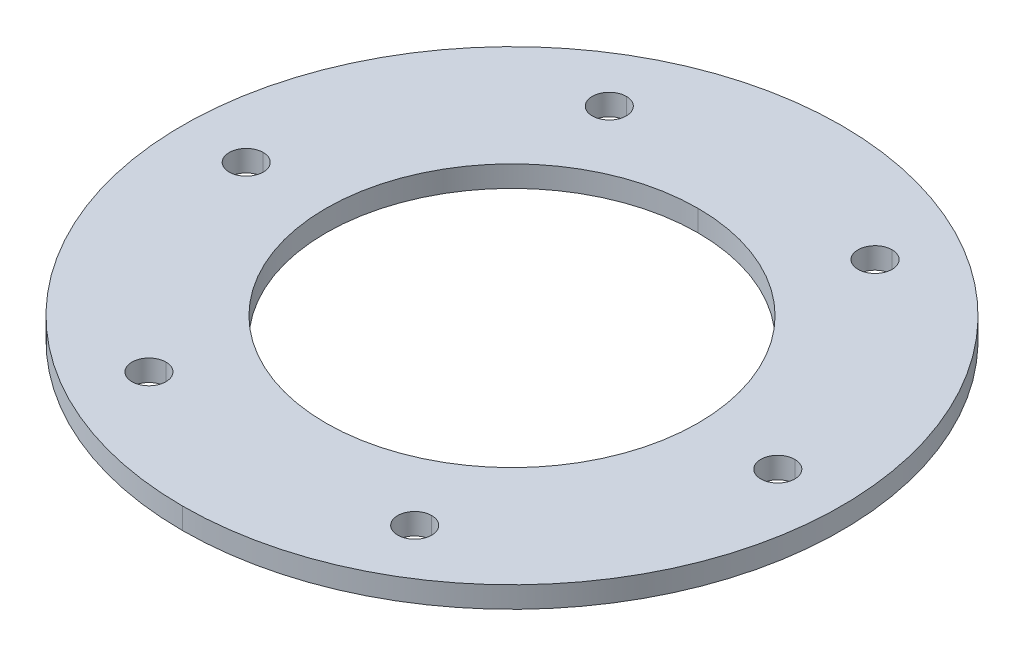
ISO-10303-21;
HEADER;
FILE_DESCRIPTION(('STEP AP214'),'2;1');
FILE_NAME('part.step','',(''),(''),'','','');
FILE_SCHEMA(('AUTOMOTIVE_DESIGN { 1 0 10303 214 1 1 1 1 }'));
ENDSEC;
DATA;
#1=APPLICATION_CONTEXT('core data for automotive mechanical design processes');
#2=APPLICATION_PROTOCOL_DEFINITION('international standard','automotive_design',2000,#1);
#3=PRODUCT_CONTEXT('',#1,'mechanical');
#4=PRODUCT('Part','Part','',(#3));
#5=PRODUCT_RELATED_PRODUCT_CATEGORY('part','',(#4));
#6=PRODUCT_DEFINITION_FORMATION('','',#4);
#7=PRODUCT_DEFINITION_CONTEXT('part definition',#1,'design');
#8=PRODUCT_DEFINITION('design','',#6,#7);
#9=PRODUCT_DEFINITION_SHAPE('','',#8);
#10=(LENGTH_UNIT() NAMED_UNIT(*) SI_UNIT(.MILLI.,.METRE.));
#11=(NAMED_UNIT(*) PLANE_ANGLE_UNIT() SI_UNIT($,.RADIAN.));
#12=(NAMED_UNIT(*) SI_UNIT($,.STERADIAN.) SOLID_ANGLE_UNIT());
#13=UNCERTAINTY_MEASURE_WITH_UNIT(LENGTH_MEASURE(1.E-05),#10,'distance_accuracy_value','');
#14=(GEOMETRIC_REPRESENTATION_CONTEXT(3) GLOBAL_UNCERTAINTY_ASSIGNED_CONTEXT((#13)) GLOBAL_UNIT_ASSIGNED_CONTEXT((#10,
#11,#12)) REPRESENTATION_CONTEXT('',''));
#15=CARTESIAN_POINT('',(0.,0.,0.));
#16=DIRECTION('',(0.,0.,1.));
#17=DIRECTION('',(1.,0.,0.));
#18=AXIS2_PLACEMENT_3D('',#15,#16,#17);
#19=CARTESIAN_POINT('',(-25.,-14.,0.));
#20=DIRECTION('',(0.,1.,0.));
#21=DIRECTION('',(0.,0.,1.));
#22=AXIS2_PLACEMENT_3D('',#19,#20,#21);
#23=CYLINDRICAL_SURFACE('',#22,1.6);
#24=DIRECTION('',(0.,1.,0.));
#25=VECTOR('',#24,1.);
#26=CARTESIAN_POINT('',(-25.,-14.,-1.6));
#27=LINE('',#26,#25);
#28=CARTESIAN_POINT('',(-25.,0.,-1.6));
#29=VERTEX_POINT('',#28);
#30=CARTESIAN_POINT('',(-25.,2.,-1.6));
#31=VERTEX_POINT('',#30);
#32=EDGE_CURVE('E253',#29,#31,#27,.T.);
#33=ORIENTED_EDGE('',*,*,#32,.F.);
#34=CARTESIAN_POINT('',(-25.,0.,0.));
#35=DIRECTION('',(0.,1.,0.));
#36=DIRECTION('',(0.,0.,1.));
#37=AXIS2_PLACEMENT_3D('',#34,#35,#36);
#38=CIRCLE('',#37,1.6);
#39=CARTESIAN_POINT('',(-25.,0.,1.6));
#40=VERTEX_POINT('',#39);
#41=EDGE_CURVE('E247',#40,#29,#38,.T.);
#42=ORIENTED_EDGE('',*,*,#41,.F.);
#43=DIRECTION('',(0.,1.,0.));
#44=VECTOR('',#43,1.);
#45=CARTESIAN_POINT('',(-25.,-14.,1.6));
#46=LINE('',#45,#44);
#47=CARTESIAN_POINT('',(-25.,2.,1.6));
#48=VERTEX_POINT('',#47);
#49=EDGE_CURVE('E20',#40,#48,#46,.T.);
#50=ORIENTED_EDGE('',*,*,#49,.T.);
#51=CARTESIAN_POINT('',(-25.,2.,0.));
#52=DIRECTION('',(0.,1.,0.));
#53=DIRECTION('',(0.,0.,1.));
#54=AXIS2_PLACEMENT_3D('',#51,#52,#53);
#55=CIRCLE('',#54,1.6);
#56=EDGE_CURVE('E259',#48,#31,#55,.T.);
#57=ORIENTED_EDGE('',*,*,#56,.T.);
#58=EDGE_LOOP('',(#33,#42,#50,#57));
#59=FACE_BOUND('',#58,.T.);
#60=ADVANCED_FACE('F16',(#59),#23,.F.);
#61=CARTESIAN_POINT('',(-12.5,-14.,-21.650635094611));
#62=DIRECTION('',(0.,1.,0.));
#63=DIRECTION('',(0.,0.,1.));
#64=AXIS2_PLACEMENT_3D('',#61,#62,#63);
#65=CYLINDRICAL_SURFACE('',#64,1.6);
#66=DIRECTION('',(0.,1.,0.));
#67=VECTOR('',#66,1.);
#68=CARTESIAN_POINT('',(-12.5,-14.,-23.2506350946109));
#69=LINE('',#68,#67);
#70=CARTESIAN_POINT('',(-12.5,0.,-23.2506350946109));
#71=VERTEX_POINT('',#70);
#72=CARTESIAN_POINT('',(-12.5,2.,-23.2506350946109));
#73=VERTEX_POINT('',#72);
#74=EDGE_CURVE('E205',#71,#73,#69,.T.);
#75=ORIENTED_EDGE('',*,*,#74,.F.);
#76=CARTESIAN_POINT('',(-12.5,0.,-21.650635094611));
#77=DIRECTION('',(0.,1.,0.));
#78=DIRECTION('',(0.,0.,1.));
#79=AXIS2_PLACEMENT_3D('',#76,#77,#78);
#80=CIRCLE('',#79,1.6);
#81=CARTESIAN_POINT('',(-12.5,0.,-20.0506350946109));
#82=VERTEX_POINT('',#81);
#83=EDGE_CURVE('E176',#82,#71,#80,.T.);
#84=ORIENTED_EDGE('',*,*,#83,.F.);
#85=DIRECTION('',(0.,1.,0.));
#86=VECTOR('',#85,1.);
#87=CARTESIAN_POINT('',(-12.5,-14.,-20.0506350946109));
#88=LINE('',#87,#86);
#89=CARTESIAN_POINT('',(-12.5,2.,-20.0506350946109));
#90=VERTEX_POINT('',#89);
#91=EDGE_CURVE('E189',#82,#90,#88,.T.);
#92=ORIENTED_EDGE('',*,*,#91,.T.);
#93=CARTESIAN_POINT('',(-12.5,2.,-21.650635094611));
#94=DIRECTION('',(0.,1.,0.));
#95=DIRECTION('',(0.,0.,1.));
#96=AXIS2_PLACEMENT_3D('',#93,#94,#95);
#97=CIRCLE('',#96,1.6);
#98=EDGE_CURVE('E262',#90,#73,#97,.T.);
#99=ORIENTED_EDGE('',*,*,#98,.T.);
#100=EDGE_LOOP('',(#75,#84,#92,#99));
#101=FACE_BOUND('',#100,.T.);
#102=ADVANCED_FACE('F384',(#101),#65,.F.);
#103=CARTESIAN_POINT('',(12.5,-14.,-21.650635094611));
#104=DIRECTION('',(0.,1.,0.));
#105=DIRECTION('',(0.,0.,1.));
#106=AXIS2_PLACEMENT_3D('',#103,#104,#105);
#107=CYLINDRICAL_SURFACE('',#106,1.6);
#108=DIRECTION('',(0.,1.,0.));
#109=VECTOR('',#108,1.);
#110=CARTESIAN_POINT('',(12.5,-14.,-23.2506350946109));
#111=LINE('',#110,#109);
#112=CARTESIAN_POINT('',(12.5,0.,-23.2506350946109));
#113=VERTEX_POINT('',#112);
#114=CARTESIAN_POINT('',(12.5,2.,-23.2506350946109));
#115=VERTEX_POINT('',#114);
#116=EDGE_CURVE('E170',#113,#115,#111,.T.);
#117=ORIENTED_EDGE('',*,*,#116,.F.);
#118=CARTESIAN_POINT('',(12.5,0.,-21.650635094611));
#119=DIRECTION('',(0.,1.,0.));
#120=DIRECTION('',(0.,0.,1.));
#121=AXIS2_PLACEMENT_3D('',#118,#119,#120);
#122=CIRCLE('',#121,1.6);
#123=CARTESIAN_POINT('',(12.5,0.,-20.0506350946109));
#124=VERTEX_POINT('',#123);
#125=EDGE_CURVE('E164',#124,#113,#122,.T.);
#126=ORIENTED_EDGE('',*,*,#125,.F.);
#127=DIRECTION('',(0.,1.,0.));
#128=VECTOR('',#127,1.);
#129=CARTESIAN_POINT('',(12.5,-14.,-20.0506350946109));
#130=LINE('',#129,#128);
#131=CARTESIAN_POINT('',(12.5,2.,-20.0506350946109));
#132=VERTEX_POINT('',#131);
#133=EDGE_CURVE('E167',#124,#132,#130,.T.);
#134=ORIENTED_EDGE('',*,*,#133,.T.);
#135=CARTESIAN_POINT('',(12.5,2.,-21.650635094611));
#136=DIRECTION('',(0.,1.,0.));
#137=DIRECTION('',(0.,0.,1.));
#138=AXIS2_PLACEMENT_3D('',#135,#136,#137);
#139=CIRCLE('',#138,1.6);
#140=EDGE_CURVE('E311',#132,#115,#139,.T.);
#141=ORIENTED_EDGE('',*,*,#140,.T.);
#142=EDGE_LOOP('',(#117,#126,#134,#141));
#143=FACE_BOUND('',#142,.T.);
#144=ADVANCED_FACE('F166',(#143),#107,.F.);
#145=CARTESIAN_POINT('',(-12.5,-14.,21.650635094611));
#146=DIRECTION('',(0.,1.,0.));
#147=DIRECTION('',(0.,0.,1.));
#148=AXIS2_PLACEMENT_3D('',#145,#146,#147);
#149=CYLINDRICAL_SURFACE('',#148,1.6);
#150=DIRECTION('',(0.,1.,0.));
#151=VECTOR('',#150,1.);
#152=CARTESIAN_POINT('',(-12.5,-14.,20.0506350946109));
#153=LINE('',#152,#151);
#154=CARTESIAN_POINT('',(-12.5,0.,20.0506350946109));
#155=VERTEX_POINT('',#154);
#156=CARTESIAN_POINT('',(-12.5,2.,20.0506350946109));
#157=VERTEX_POINT('',#156);
#158=EDGE_CURVE('E226',#155,#157,#153,.T.);
#159=ORIENTED_EDGE('',*,*,#158,.F.);
#160=CARTESIAN_POINT('',(-12.5,0.,21.650635094611));
#161=DIRECTION('',(0.,1.,0.));
#162=DIRECTION('',(0.,0.,1.));
#163=AXIS2_PLACEMENT_3D('',#160,#161,#162);
#164=CIRCLE('',#163,1.6);
#165=CARTESIAN_POINT('',(-12.5,0.,23.250635094611));
#166=VERTEX_POINT('',#165);
#167=EDGE_CURVE('E175',#166,#155,#164,.T.);
#168=ORIENTED_EDGE('',*,*,#167,.F.);
#169=DIRECTION('',(0.,1.,0.));
#170=VECTOR('',#169,1.);
#171=CARTESIAN_POINT('',(-12.5,-14.,23.250635094611));
#172=LINE('',#171,#170);
#173=CARTESIAN_POINT('',(-12.5,2.,23.250635094611));
#174=VERTEX_POINT('',#173);
#175=EDGE_CURVE('E295',#166,#174,#172,.T.);
#176=ORIENTED_EDGE('',*,*,#175,.T.);
#177=CARTESIAN_POINT('',(-12.5,2.,21.650635094611));
#178=DIRECTION('',(0.,1.,0.));
#179=DIRECTION('',(0.,0.,1.));
#180=AXIS2_PLACEMENT_3D('',#177,#178,#179);
#181=CIRCLE('',#180,1.6);
#182=EDGE_CURVE('E252',#174,#157,#181,.T.);
#183=ORIENTED_EDGE('',*,*,#182,.T.);
#184=EDGE_LOOP('',(#159,#168,#176,#183));
#185=FACE_BOUND('',#184,.T.);
#186=ADVANCED_FACE('F357',(#185),#149,.F.);
#187=CARTESIAN_POINT('',(12.5,-14.,21.650635094611));
#188=DIRECTION('',(0.,1.,0.));
#189=DIRECTION('',(0.,0.,1.));
#190=AXIS2_PLACEMENT_3D('',#187,#188,#189);
#191=CYLINDRICAL_SURFACE('',#190,1.6);
#192=DIRECTION('',(0.,1.,0.));
#193=VECTOR('',#192,1.);
#194=CARTESIAN_POINT('',(12.5,-14.,20.0506350946109));
#195=LINE('',#194,#193);
#196=CARTESIAN_POINT('',(12.5,0.,20.0506350946109));
#197=VERTEX_POINT('',#196);
#198=CARTESIAN_POINT('',(12.5,2.,20.0506350946109));
#199=VERTEX_POINT('',#198);
#200=EDGE_CURVE('E274',#197,#199,#195,.T.);
#201=ORIENTED_EDGE('',*,*,#200,.F.);
#202=CARTESIAN_POINT('',(12.5,0.,21.650635094611));
#203=DIRECTION('',(0.,1.,0.));
#204=DIRECTION('',(0.,0.,1.));
#205=AXIS2_PLACEMENT_3D('',#202,#203,#204);
#206=CIRCLE('',#205,1.6);
#207=CARTESIAN_POINT('',(12.5,0.,23.2506350946109));
#208=VERTEX_POINT('',#207);
#209=EDGE_CURVE('E265',#208,#197,#206,.T.);
#210=ORIENTED_EDGE('',*,*,#209,.F.);
#211=DIRECTION('',(0.,1.,0.));
#212=VECTOR('',#211,1.);
#213=CARTESIAN_POINT('',(12.5,-14.,23.2506350946109));
#214=LINE('',#213,#212);
#215=CARTESIAN_POINT('',(12.5,2.,23.2506350946109));
#216=VERTEX_POINT('',#215);
#217=EDGE_CURVE('E234',#208,#216,#214,.T.);
#218=ORIENTED_EDGE('',*,*,#217,.T.);
#219=CARTESIAN_POINT('',(12.5,2.,21.650635094611));
#220=DIRECTION('',(0.,1.,0.));
#221=DIRECTION('',(0.,0.,1.));
#222=AXIS2_PLACEMENT_3D('',#219,#220,#221);
#223=CIRCLE('',#222,1.6);
#224=EDGE_CURVE('E249',#216,#199,#223,.T.);
#225=ORIENTED_EDGE('',*,*,#224,.T.);
#226=EDGE_LOOP('',(#201,#210,#218,#225));
#227=FACE_BOUND('',#226,.T.);
#228=ADVANCED_FACE('F405',(#227),#191,.F.);
#229=CARTESIAN_POINT('',(25.,-14.,0.));
#230=DIRECTION('',(0.,1.,0.));
#231=DIRECTION('',(0.,0.,1.));
#232=AXIS2_PLACEMENT_3D('',#229,#230,#231);
#233=CYLINDRICAL_SURFACE('',#232,1.6);
#234=DIRECTION('',(0.,1.,0.));
#235=VECTOR('',#234,1.);
#236=CARTESIAN_POINT('',(25.,-14.,-1.6));
#237=LINE('',#236,#235);
#238=CARTESIAN_POINT('',(25.,0.,-1.6));
#239=VERTEX_POINT('',#238);
#240=CARTESIAN_POINT('',(25.,2.,-1.6));
#241=VERTEX_POINT('',#240);
#242=EDGE_CURVE('E213',#239,#241,#237,.T.);
#243=ORIENTED_EDGE('',*,*,#242,.F.);
#244=CARTESIAN_POINT('',(25.,0.,0.));
#245=DIRECTION('',(0.,1.,0.));
#246=DIRECTION('',(0.,0.,1.));
#247=AXIS2_PLACEMENT_3D('',#244,#245,#246);
#248=CIRCLE('',#247,1.6);
#249=CARTESIAN_POINT('',(25.,0.,1.6));
#250=VERTEX_POINT('',#249);
#251=EDGE_CURVE('E27',#250,#239,#248,.T.);
#252=ORIENTED_EDGE('',*,*,#251,.F.);
#253=DIRECTION('',(0.,1.,0.));
#254=VECTOR('',#253,1.);
#255=CARTESIAN_POINT('',(25.,-14.,1.6));
#256=LINE('',#255,#254);
#257=CARTESIAN_POINT('',(25.,2.,1.6));
#258=VERTEX_POINT('',#257);
#259=EDGE_CURVE('E302',#250,#258,#256,.T.);
#260=ORIENTED_EDGE('',*,*,#259,.T.);
#261=CARTESIAN_POINT('',(25.,2.,0.));
#262=DIRECTION('',(0.,1.,0.));
#263=DIRECTION('',(0.,0.,1.));
#264=AXIS2_PLACEMENT_3D('',#261,#262,#263);
#265=CIRCLE('',#264,1.6);
#266=EDGE_CURVE('E248',#258,#241,#265,.T.);
#267=ORIENTED_EDGE('',*,*,#266,.T.);
#268=EDGE_LOOP('',(#243,#252,#260,#267));
#269=FACE_BOUND('',#268,.T.);
#270=ADVANCED_FACE('F344',(#269),#233,.F.);
#271=CARTESIAN_POINT('',(0.,0.,0.));
#272=DIRECTION('',(0.,1.,0.));
#273=DIRECTION('',(0.,0.,1.));
#274=AXIS2_PLACEMENT_3D('',#271,#272,#273);
#275=CYLINDRICAL_SURFACE('',#274,17.5);
#276=DIRECTION('',(0.,1.,0.));
#277=VECTOR('',#276,1.);
#278=CARTESIAN_POINT('',(0.,0.,-17.5));
#279=LINE('',#278,#277);
#280=CARTESIAN_POINT('',(0.,0.,-17.5));
#281=VERTEX_POINT('',#280);
#282=CARTESIAN_POINT('',(0.,2.,-17.5));
#283=VERTEX_POINT('',#282);
#284=EDGE_CURVE('E239',#281,#283,#279,.T.);
#285=ORIENTED_EDGE('',*,*,#284,.F.);
#286=CARTESIAN_POINT('',(0.,0.,0.));
#287=DIRECTION('',(0.,1.,0.));
#288=DIRECTION('',(0.,0.,1.));
#289=AXIS2_PLACEMENT_3D('',#286,#287,#288);
#290=CIRCLE('',#289,17.5);
#291=CARTESIAN_POINT('',(0.,0.,17.5));
#292=VERTEX_POINT('',#291);
#293=EDGE_CURVE('E11',#292,#281,#290,.T.);
#294=ORIENTED_EDGE('',*,*,#293,.F.);
#295=DIRECTION('',(0.,1.,0.));
#296=VECTOR('',#295,1.);
#297=CARTESIAN_POINT('',(0.,0.,17.5));
#298=LINE('',#297,#296);
#299=CARTESIAN_POINT('',(0.,2.,17.5));
#300=VERTEX_POINT('',#299);
#301=EDGE_CURVE('E287',#292,#300,#298,.T.);
#302=ORIENTED_EDGE('',*,*,#301,.T.);
#303=CARTESIAN_POINT('',(0.,2.,0.));
#304=DIRECTION('',(0.,1.,0.));
#305=DIRECTION('',(0.,0.,1.));
#306=AXIS2_PLACEMENT_3D('',#303,#304,#305);
#307=CIRCLE('',#306,17.5);
#308=EDGE_CURVE('E244',#300,#283,#307,.T.);
#309=ORIENTED_EDGE('',*,*,#308,.T.);
#310=EDGE_LOOP('',(#285,#294,#302,#309));
#311=FACE_BOUND('',#310,.T.);
#312=ADVANCED_FACE('F348',(#311),#275,.F.);
#313=CARTESIAN_POINT('',(0.,0.,0.));
#314=DIRECTION('',(0.,1.,0.));
#315=DIRECTION('',(1.,0.,0.));
#316=AXIS2_PLACEMENT_3D('',#313,#314,#315);
#317=PLANE('',#316);
#318=ORIENTED_EDGE('',*,*,#293,.T.);
#319=CARTESIAN_POINT('',(0.,0.,0.));
#320=DIRECTION('',(0.,1.,0.));
#321=DIRECTION('',(0.,0.,1.));
#322=AXIS2_PLACEMENT_3D('',#319,#320,#321);
#323=CIRCLE('',#322,17.5);
#324=EDGE_CURVE('E243',#281,#292,#323,.T.);
#325=ORIENTED_EDGE('',*,*,#324,.T.);
#326=EDGE_LOOP('',(#318,#325));
#327=FACE_BOUND('',#326,.T.);
#328=ORIENTED_EDGE('',*,*,#251,.T.);
#329=CARTESIAN_POINT('',(25.,0.,0.));
#330=DIRECTION('',(0.,1.,0.));
#331=DIRECTION('',(0.,0.,1.));
#332=AXIS2_PLACEMENT_3D('',#329,#330,#331);
#333=CIRCLE('',#332,1.6);
#334=EDGE_CURVE('E218',#239,#250,#333,.T.);
#335=ORIENTED_EDGE('',*,*,#334,.T.);
#336=EDGE_LOOP('',(#328,#335));
#337=FACE_BOUND('',#336,.T.);
#338=ORIENTED_EDGE('',*,*,#209,.T.);
#339=CARTESIAN_POINT('',(12.5,0.,21.650635094611));
#340=DIRECTION('',(0.,1.,0.));
#341=DIRECTION('',(0.,0.,1.));
#342=AXIS2_PLACEMENT_3D('',#339,#340,#341);
#343=CIRCLE('',#342,1.6);
#344=EDGE_CURVE('E291',#197,#208,#343,.T.);
#345=ORIENTED_EDGE('',*,*,#344,.T.);
#346=EDGE_LOOP('',(#338,#345));
#347=FACE_BOUND('',#346,.T.);
#348=ORIENTED_EDGE('',*,*,#167,.T.);
#349=CARTESIAN_POINT('',(-12.5,0.,21.650635094611));
#350=DIRECTION('',(0.,1.,0.));
#351=DIRECTION('',(0.,0.,1.));
#352=AXIS2_PLACEMENT_3D('',#349,#350,#351);
#353=CIRCLE('',#352,1.6);
#354=EDGE_CURVE('E184',#155,#166,#353,.T.);
#355=ORIENTED_EDGE('',*,*,#354,.T.);
#356=EDGE_LOOP('',(#348,#355));
#357=FACE_BOUND('',#356,.T.);
#358=ORIENTED_EDGE('',*,*,#125,.T.);
#359=CARTESIAN_POINT('',(12.5,0.,-21.650635094611));
#360=DIRECTION('',(0.,1.,0.));
#361=DIRECTION('',(0.,0.,1.));
#362=AXIS2_PLACEMENT_3D('',#359,#360,#361);
#363=CIRCLE('',#362,1.6);
#364=EDGE_CURVE('E180',#113,#124,#363,.T.);
#365=ORIENTED_EDGE('',*,*,#364,.T.);
#366=EDGE_LOOP('',(#358,#365));
#367=FACE_BOUND('',#366,.T.);
#368=ORIENTED_EDGE('',*,*,#83,.T.);
#369=CARTESIAN_POINT('',(-12.5,0.,-21.650635094611));
#370=DIRECTION('',(0.,1.,0.));
#371=DIRECTION('',(0.,0.,1.));
#372=AXIS2_PLACEMENT_3D('',#369,#370,#371);
#373=CIRCLE('',#372,1.6);
#374=EDGE_CURVE('E222',#71,#82,#373,.T.);
#375=ORIENTED_EDGE('',*,*,#374,.T.);
#376=EDGE_LOOP('',(#368,#375));
#377=FACE_BOUND('',#376,.T.);
#378=ORIENTED_EDGE('',*,*,#41,.T.);
#379=CARTESIAN_POINT('',(-25.,0.,0.));
#380=DIRECTION('',(0.,1.,0.));
#381=DIRECTION('',(0.,0.,1.));
#382=AXIS2_PLACEMENT_3D('',#379,#380,#381);
#383=CIRCLE('',#382,1.6);
#384=EDGE_CURVE('E258',#29,#40,#383,.T.);
#385=ORIENTED_EDGE('',*,*,#384,.T.);
#386=EDGE_LOOP('',(#378,#385));
#387=FACE_BOUND('',#386,.T.);
#388=CARTESIAN_POINT('',(0.,0.,0.));
#389=DIRECTION('',(0.,1.,0.));
#390=DIRECTION('',(0.,0.,1.));
#391=AXIS2_PLACEMENT_3D('',#388,#389,#390);
#392=CIRCLE('',#391,31.);
#393=CARTESIAN_POINT('',(0.,0.,-31.));
#394=VERTEX_POINT('',#393);
#395=CARTESIAN_POINT('',(0.,0.,31.));
#396=VERTEX_POINT('',#395);
#397=EDGE_CURVE('E40',#394,#396,#392,.T.);
#398=ORIENTED_EDGE('',*,*,#397,.F.);
#399=CARTESIAN_POINT('',(0.,0.,0.));
#400=DIRECTION('',(0.,1.,0.));
#401=DIRECTION('',(0.,0.,1.));
#402=AXIS2_PLACEMENT_3D('',#399,#400,#401);
#403=CIRCLE('',#402,31.);
#404=EDGE_CURVE('E207',#396,#394,#403,.T.);
#405=ORIENTED_EDGE('',*,*,#404,.F.);
#406=EDGE_LOOP('',(#398,#405));
#407=FACE_BOUND('',#406,.T.);
#408=ADVANCED_FACE('F186',(#327,#337,#347,#357,#367,#377,#387,#407),#317,.F.);
#409=CARTESIAN_POINT('',(0.,2.,0.));
#410=DIRECTION('',(0.,1.,0.));
#411=DIRECTION('',(1.,0.,0.));
#412=AXIS2_PLACEMENT_3D('',#409,#410,#411);
#413=PLANE('',#412);
#414=ORIENTED_EDGE('',*,*,#308,.F.);
#415=CARTESIAN_POINT('',(0.,2.,0.));
#416=DIRECTION('',(0.,1.,0.));
#417=DIRECTION('',(0.,0.,1.));
#418=AXIS2_PLACEMENT_3D('',#415,#416,#417);
#419=CIRCLE('',#418,17.5);
#420=EDGE_CURVE('E201',#283,#300,#419,.T.);
#421=ORIENTED_EDGE('',*,*,#420,.F.);
#422=EDGE_LOOP('',(#414,#421));
#423=FACE_BOUND('',#422,.T.);
#424=ORIENTED_EDGE('',*,*,#266,.F.);
#425=CARTESIAN_POINT('',(25.,2.,0.));
#426=DIRECTION('',(0.,1.,0.));
#427=DIRECTION('',(0.,0.,1.));
#428=AXIS2_PLACEMENT_3D('',#425,#426,#427);
#429=CIRCLE('',#428,1.6);
#430=EDGE_CURVE('E217',#241,#258,#429,.T.);
#431=ORIENTED_EDGE('',*,*,#430,.F.);
#432=EDGE_LOOP('',(#424,#431));
#433=FACE_BOUND('',#432,.T.);
#434=ORIENTED_EDGE('',*,*,#224,.F.);
#435=CARTESIAN_POINT('',(12.5,2.,21.650635094611));
#436=DIRECTION('',(0.,1.,0.));
#437=DIRECTION('',(0.,0.,1.));
#438=AXIS2_PLACEMENT_3D('',#435,#436,#437);
#439=CIRCLE('',#438,1.6);
#440=EDGE_CURVE('E238',#199,#216,#439,.T.);
#441=ORIENTED_EDGE('',*,*,#440,.F.);
#442=EDGE_LOOP('',(#434,#441));
#443=FACE_BOUND('',#442,.T.);
#444=ORIENTED_EDGE('',*,*,#182,.F.);
#445=CARTESIAN_POINT('',(-12.5,2.,21.650635094611));
#446=DIRECTION('',(0.,1.,0.));
#447=DIRECTION('',(0.,0.,1.));
#448=AXIS2_PLACEMENT_3D('',#445,#446,#447);
#449=CIRCLE('',#448,1.6);
#450=EDGE_CURVE('E230',#157,#174,#449,.T.);
#451=ORIENTED_EDGE('',*,*,#450,.F.);
#452=EDGE_LOOP('',(#444,#451));
#453=FACE_BOUND('',#452,.T.);
#454=ORIENTED_EDGE('',*,*,#140,.F.);
#455=CARTESIAN_POINT('',(12.5,2.,-21.650635094611));
#456=DIRECTION('',(0.,1.,0.));
#457=DIRECTION('',(0.,0.,1.));
#458=AXIS2_PLACEMENT_3D('',#455,#456,#457);
#459=CIRCLE('',#458,1.6);
#460=EDGE_CURVE('E182',#115,#132,#459,.T.);
#461=ORIENTED_EDGE('',*,*,#460,.F.);
#462=EDGE_LOOP('',(#454,#461));
#463=FACE_BOUND('',#462,.T.);
#464=ORIENTED_EDGE('',*,*,#98,.F.);
#465=CARTESIAN_POINT('',(-12.5,2.,-21.650635094611));
#466=DIRECTION('',(0.,1.,0.));
#467=DIRECTION('',(0.,0.,1.));
#468=AXIS2_PLACEMENT_3D('',#465,#466,#467);
#469=CIRCLE('',#468,1.6);
#470=EDGE_CURVE('E197',#73,#90,#469,.T.);
#471=ORIENTED_EDGE('',*,*,#470,.F.);
#472=EDGE_LOOP('',(#464,#471));
#473=FACE_BOUND('',#472,.T.);
#474=ORIENTED_EDGE('',*,*,#56,.F.);
#475=CARTESIAN_POINT('',(-25.,2.,0.));
#476=DIRECTION('',(0.,1.,0.));
#477=DIRECTION('',(0.,0.,1.));
#478=AXIS2_PLACEMENT_3D('',#475,#476,#477);
#479=CIRCLE('',#478,1.6);
#480=EDGE_CURVE('E257',#31,#48,#479,.T.);
#481=ORIENTED_EDGE('',*,*,#480,.F.);
#482=EDGE_LOOP('',(#474,#481));
#483=FACE_BOUND('',#482,.T.);
#484=CARTESIAN_POINT('',(0.,2.,0.));
#485=DIRECTION('',(0.,1.,0.));
#486=DIRECTION('',(0.,0.,1.));
#487=AXIS2_PLACEMENT_3D('',#484,#485,#486);
#488=CIRCLE('',#487,31.);
#489=CARTESIAN_POINT('',(0.,2.,-31.));
#490=VERTEX_POINT('',#489);
#491=CARTESIAN_POINT('',(0.,2.,31.));
#492=VERTEX_POINT('',#491);
#493=EDGE_CURVE('E223',#490,#492,#488,.T.);
#494=ORIENTED_EDGE('',*,*,#493,.T.);
#495=CARTESIAN_POINT('',(0.,2.,0.));
#496=DIRECTION('',(0.,1.,0.));
#497=DIRECTION('',(0.,0.,1.));
#498=AXIS2_PLACEMENT_3D('',#495,#496,#497);
#499=CIRCLE('',#498,31.);
#500=EDGE_CURVE('E280',#492,#490,#499,.T.);
#501=ORIENTED_EDGE('',*,*,#500,.T.);
#502=EDGE_LOOP('',(#494,#501));
#503=FACE_BOUND('',#502,.T.);
#504=ADVANCED_FACE('F341',(#423,#433,#443,#453,#463,#473,#483,#503),#413,.T.);
#505=CARTESIAN_POINT('',(0.,2.,0.));
#506=DIRECTION('',(0.,-1.,0.));
#507=DIRECTION('',(0.,0.,-1.));
#508=AXIS2_PLACEMENT_3D('',#505,#506,#507);
#509=CYLINDRICAL_SURFACE('',#508,31.);
#510=DIRECTION('',(0.,-1.,0.));
#511=VECTOR('',#510,1.);
#512=CARTESIAN_POINT('',(0.,2.,31.));
#513=LINE('',#512,#511);
#514=EDGE_CURVE('E212',#492,#396,#513,.T.);
#515=ORIENTED_EDGE('',*,*,#514,.F.);
#516=ORIENTED_EDGE('',*,*,#493,.F.);
#517=DIRECTION('',(0.,-1.,0.));
#518=VECTOR('',#517,1.);
#519=CARTESIAN_POINT('',(0.,2.,-31.));
#520=LINE('',#519,#518);
#521=EDGE_CURVE('E211',#490,#394,#520,.T.);
#522=ORIENTED_EDGE('',*,*,#521,.T.);
#523=ORIENTED_EDGE('',*,*,#397,.T.);
#524=EDGE_LOOP('',(#515,#516,#522,#523));
#525=FACE_BOUND('',#524,.T.);
#526=ADVANCED_FACE('F371',(#525),#509,.T.);
#527=CARTESIAN_POINT('',(0.,2.,0.));
#528=DIRECTION('',(0.,-1.,0.));
#529=DIRECTION('',(0.,0.,-1.));
#530=AXIS2_PLACEMENT_3D('',#527,#528,#529);
#531=CYLINDRICAL_SURFACE('',#530,31.);
#532=ORIENTED_EDGE('',*,*,#500,.F.);
#533=ORIENTED_EDGE('',*,*,#514,.T.);
#534=ORIENTED_EDGE('',*,*,#404,.T.);
#535=ORIENTED_EDGE('',*,*,#521,.F.);
#536=EDGE_LOOP('',(#532,#533,#534,#535));
#537=FACE_BOUND('',#536,.T.);
#538=ADVANCED_FACE('F18',(#537),#531,.T.);
#539=CARTESIAN_POINT('',(0.,0.,0.));
#540=DIRECTION('',(0.,1.,0.));
#541=DIRECTION('',(0.,0.,1.));
#542=AXIS2_PLACEMENT_3D('',#539,#540,#541);
#543=CYLINDRICAL_SURFACE('',#542,17.5);
#544=ORIENTED_EDGE('',*,*,#324,.F.);
#545=ORIENTED_EDGE('',*,*,#284,.T.);
#546=ORIENTED_EDGE('',*,*,#420,.T.);
#547=ORIENTED_EDGE('',*,*,#301,.F.);
#548=EDGE_LOOP('',(#544,#545,#546,#547));
#549=FACE_BOUND('',#548,.T.);
#550=ADVANCED_FACE('F626',(#549),#543,.F.);
#551=CARTESIAN_POINT('',(25.,-14.,0.));
#552=DIRECTION('',(0.,1.,0.));
#553=DIRECTION('',(0.,0.,1.));
#554=AXIS2_PLACEMENT_3D('',#551,#552,#553);
#555=CYLINDRICAL_SURFACE('',#554,1.6);
#556=ORIENTED_EDGE('',*,*,#334,.F.);
#557=ORIENTED_EDGE('',*,*,#242,.T.);
#558=ORIENTED_EDGE('',*,*,#430,.T.);
#559=ORIENTED_EDGE('',*,*,#259,.F.);
#560=EDGE_LOOP('',(#556,#557,#558,#559));
#561=FACE_BOUND('',#560,.T.);
#562=ADVANCED_FACE('F338',(#561),#555,.F.);
#563=CARTESIAN_POINT('',(12.5,-14.,21.650635094611));
#564=DIRECTION('',(0.,1.,0.));
#565=DIRECTION('',(0.,0.,1.));
#566=AXIS2_PLACEMENT_3D('',#563,#564,#565);
#567=CYLINDRICAL_SURFACE('',#566,1.6);
#568=ORIENTED_EDGE('',*,*,#344,.F.);
#569=ORIENTED_EDGE('',*,*,#200,.T.);
#570=ORIENTED_EDGE('',*,*,#440,.T.);
#571=ORIENTED_EDGE('',*,*,#217,.F.);
#572=EDGE_LOOP('',(#568,#569,#570,#571));
#573=FACE_BOUND('',#572,.T.);
#574=ADVANCED_FACE('F406',(#573),#567,.F.);
#575=CARTESIAN_POINT('',(-12.5,-14.,21.650635094611));
#576=DIRECTION('',(0.,1.,0.));
#577=DIRECTION('',(0.,0.,1.));
#578=AXIS2_PLACEMENT_3D('',#575,#576,#577);
#579=CYLINDRICAL_SURFACE('',#578,1.6);
#580=ORIENTED_EDGE('',*,*,#354,.F.);
#581=ORIENTED_EDGE('',*,*,#158,.T.);
#582=ORIENTED_EDGE('',*,*,#450,.T.);
#583=ORIENTED_EDGE('',*,*,#175,.F.);
#584=EDGE_LOOP('',(#580,#581,#582,#583));
#585=FACE_BOUND('',#584,.T.);
#586=ADVANCED_FACE('F361',(#585),#579,.F.);
#587=CARTESIAN_POINT('',(12.5,-14.,-21.650635094611));
#588=DIRECTION('',(0.,1.,0.));
#589=DIRECTION('',(0.,0.,1.));
#590=AXIS2_PLACEMENT_3D('',#587,#588,#589);
#591=CYLINDRICAL_SURFACE('',#590,1.6);
#592=ORIENTED_EDGE('',*,*,#364,.F.);
#593=ORIENTED_EDGE('',*,*,#116,.T.);
#594=ORIENTED_EDGE('',*,*,#460,.T.);
#595=ORIENTED_EDGE('',*,*,#133,.F.);
#596=EDGE_LOOP('',(#592,#593,#594,#595));
#597=FACE_BOUND('',#596,.T.);
#598=ADVANCED_FACE('F179',(#597),#591,.F.);
#599=CARTESIAN_POINT('',(-12.5,-14.,-21.650635094611));
#600=DIRECTION('',(0.,1.,0.));
#601=DIRECTION('',(0.,0.,1.));
#602=AXIS2_PLACEMENT_3D('',#599,#600,#601);
#603=CYLINDRICAL_SURFACE('',#602,1.6);
#604=ORIENTED_EDGE('',*,*,#374,.F.);
#605=ORIENTED_EDGE('',*,*,#74,.T.);
#606=ORIENTED_EDGE('',*,*,#470,.T.);
#607=ORIENTED_EDGE('',*,*,#91,.F.);
#608=EDGE_LOOP('',(#604,#605,#606,#607));
#609=FACE_BOUND('',#608,.T.);
#610=ADVANCED_FACE('F398',(#609),#603,.F.);
#611=CARTESIAN_POINT('',(-25.,-14.,0.));
#612=DIRECTION('',(0.,1.,0.));
#613=DIRECTION('',(0.,0.,1.));
#614=AXIS2_PLACEMENT_3D('',#611,#612,#613);
#615=CYLINDRICAL_SURFACE('',#614,1.6);
#616=ORIENTED_EDGE('',*,*,#384,.F.);
#617=ORIENTED_EDGE('',*,*,#32,.T.);
#618=ORIENTED_EDGE('',*,*,#480,.T.);
#619=ORIENTED_EDGE('',*,*,#49,.F.);
#620=EDGE_LOOP('',(#616,#617,#618,#619));
#621=FACE_BOUND('',#620,.T.);
#622=ADVANCED_FACE('F399',(#621),#615,.F.);
#623=CLOSED_SHELL('',(#60,#102,#144,#186,#228,#270,#312,#408,#504,#526,#538,#550,#562,#574,#586,
#598,#610,#622));
#624=MANIFOLD_SOLID_BREP('B1',#623);
#625=ADVANCED_BREP_SHAPE_REPRESENTATION('',(#18,#624),#14);
#626=SHAPE_DEFINITION_REPRESENTATION(#9,#625);
ENDSEC;
END-ISO-10303-21;
